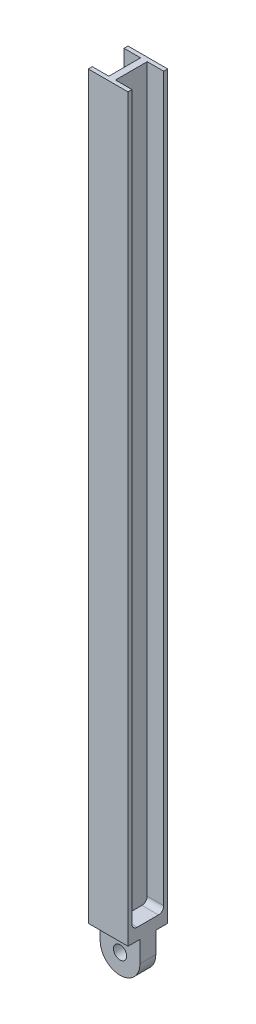
ISO-10303-21;
HEADER;
FILE_DESCRIPTION(('STEP AP214'),'2;1');
FILE_NAME('part.step','',(''),(''),'','','');
FILE_SCHEMA(('AUTOMOTIVE_DESIGN { 1 0 10303 214 1 1 1 1 }'));
ENDSEC;
DATA;
#1=APPLICATION_CONTEXT('core data for automotive mechanical design processes');
#2=APPLICATION_PROTOCOL_DEFINITION('international standard','automotive_design',2000,#1);
#3=PRODUCT_CONTEXT('',#1,'mechanical');
#4=PRODUCT('Part','Part','',(#3));
#5=PRODUCT_RELATED_PRODUCT_CATEGORY('part','',(#4));
#6=PRODUCT_DEFINITION_FORMATION('','',#4);
#7=PRODUCT_DEFINITION_CONTEXT('part definition',#1,'design');
#8=PRODUCT_DEFINITION('design','',#6,#7);
#9=PRODUCT_DEFINITION_SHAPE('','',#8);
#10=(LENGTH_UNIT() NAMED_UNIT(*) SI_UNIT(.MILLI.,.METRE.));
#11=(NAMED_UNIT(*) PLANE_ANGLE_UNIT() SI_UNIT($,.RADIAN.));
#12=(NAMED_UNIT(*) SI_UNIT($,.STERADIAN.) SOLID_ANGLE_UNIT());
#13=UNCERTAINTY_MEASURE_WITH_UNIT(LENGTH_MEASURE(1.E-05),#10,'distance_accuracy_value','');
#14=(GEOMETRIC_REPRESENTATION_CONTEXT(3) GLOBAL_UNCERTAINTY_ASSIGNED_CONTEXT((#13)) GLOBAL_UNIT_ASSIGNED_CONTEXT((#10,
#11,#12)) REPRESENTATION_CONTEXT('',''));
#15=CARTESIAN_POINT('',(0.,0.,0.));
#16=DIRECTION('',(0.,0.,1.));
#17=DIRECTION('',(1.,0.,0.));
#18=AXIS2_PLACEMENT_3D('',#15,#16,#17);
#19=CARTESIAN_POINT('',(17.5,550.,-2.99999999999999));
#20=DIRECTION('',(-1.,0.,0.));
#21=DIRECTION('',(0.,0.,1.));
#22=AXIS2_PLACEMENT_3D('',#19,#20,#21);
#23=PLANE('',#22);
#24=DIRECTION('',(0.,0.,1.));
#25=VECTOR('',#24,1.);
#26=CARTESIAN_POINT('',(17.5,-9.,18.));
#27=LINE('',#26,#25);
#28=CARTESIAN_POINT('',(17.5,-9.,18.));
#29=VERTEX_POINT('',#28);
#30=CARTESIAN_POINT('',(17.5,-9.,27.));
#31=VERTEX_POINT('',#30);
#32=EDGE_CURVE('E195',#29,#31,#27,.T.);
#33=ORIENTED_EDGE('',*,*,#32,.F.);
#34=DIRECTION('',(0.,-1.,0.));
#35=VECTOR('',#34,1.);
#36=CARTESIAN_POINT('',(17.5,-9.,18.));
#37=LINE('',#36,#35);
#38=CARTESIAN_POINT('',(17.5,-25.,18.));
#39=VERTEX_POINT('',#38);
#40=EDGE_CURVE('E194',#29,#39,#37,.T.);
#41=ORIENTED_EDGE('',*,*,#40,.T.);
#42=DIRECTION('',(0.,0.,1.));
#43=VECTOR('',#42,1.);
#44=CARTESIAN_POINT('',(17.5,-25.,-2.99999999999999));
#45=LINE('',#44,#43);
#46=CARTESIAN_POINT('',(17.5,-25.,6.00000000000002));
#47=VERTEX_POINT('',#46);
#48=EDGE_CURVE('E174',#47,#39,#45,.T.);
#49=ORIENTED_EDGE('',*,*,#48,.F.);
#50=DIRECTION('',(0.,-1.,0.));
#51=VECTOR('',#50,1.);
#52=CARTESIAN_POINT('',(17.5,-9.,6.00000000000002));
#53=LINE('',#52,#51);
#54=CARTESIAN_POINT('',(17.5,-9.,6.00000000000002));
#55=VERTEX_POINT('',#54);
#56=EDGE_CURVE('E209',#55,#47,#53,.T.);
#57=ORIENTED_EDGE('',*,*,#56,.F.);
#58=DIRECTION('',(0.,0.,1.));
#59=VECTOR('',#58,1.);
#60=CARTESIAN_POINT('',(17.5,-9.,-2.99999999999999));
#61=LINE('',#60,#59);
#62=CARTESIAN_POINT('',(17.5,-9.,-2.99999999999999));
#63=VERTEX_POINT('',#62);
#64=EDGE_CURVE('E204',#63,#55,#61,.T.);
#65=ORIENTED_EDGE('',*,*,#64,.F.);
#66=DIRECTION('',(0.,-1.,0.));
#67=VECTOR('',#66,1.);
#68=CARTESIAN_POINT('',(17.5,550.,-2.99999999999999));
#69=LINE('',#68,#67);
#70=CARTESIAN_POINT('',(17.5,550.,-2.99999999999999));
#71=VERTEX_POINT('',#70);
#72=EDGE_CURVE('E284',#71,#63,#69,.T.);
#73=ORIENTED_EDGE('',*,*,#72,.F.);
#74=DIRECTION('',(0.,0.,-1.));
#75=VECTOR('',#74,1.);
#76=CARTESIAN_POINT('',(17.5,550.,-2.99999999999999));
#77=LINE('',#76,#75);
#78=CARTESIAN_POINT('',(17.5,550.,0.));
#79=VERTEX_POINT('',#78);
#80=EDGE_CURVE('E355',#79,#71,#77,.T.);
#81=ORIENTED_EDGE('',*,*,#80,.F.);
#82=DIRECTION('',(0.,-1.,0.));
#83=VECTOR('',#82,1.);
#84=CARTESIAN_POINT('',(17.5,550.,0.));
#85=LINE('',#84,#83);
#86=CARTESIAN_POINT('',(17.5,4.,0.));
#87=VERTEX_POINT('',#86);
#88=EDGE_CURVE('E287',#79,#87,#85,.T.);
#89=ORIENTED_EDGE('',*,*,#88,.T.);
#90=CARTESIAN_POINT('',(17.5,4.,4.));
#91=DIRECTION('',(-1.,0.,0.));
#92=DIRECTION('',(0.,0.,1.));
#93=AXIS2_PLACEMENT_3D('',#90,#91,#92);
#94=CIRCLE('',#93,4.);
#95=CARTESIAN_POINT('',(17.5,0.,4.));
#96=VERTEX_POINT('',#95);
#97=EDGE_CURVE('E234',#87,#96,#94,.T.);
#98=ORIENTED_EDGE('',*,*,#97,.T.);
#99=DIRECTION('',(0.,0.,1.));
#100=VECTOR('',#99,1.);
#101=CARTESIAN_POINT('',(17.5,0.,-2.99999999999999));
#102=LINE('',#101,#100);
#103=CARTESIAN_POINT('',(17.5,0.,20.));
#104=VERTEX_POINT('',#103);
#105=EDGE_CURVE('E211',#96,#104,#102,.T.);
#106=ORIENTED_EDGE('',*,*,#105,.T.);
#107=CARTESIAN_POINT('',(17.5,4.,20.));
#108=DIRECTION('',(-1.,0.,0.));
#109=DIRECTION('',(0.,0.,1.));
#110=AXIS2_PLACEMENT_3D('',#107,#108,#109);
#111=CIRCLE('',#110,4.);
#112=CARTESIAN_POINT('',(17.5,4.,24.));
#113=VERTEX_POINT('',#112);
#114=EDGE_CURVE('E232',#104,#113,#111,.T.);
#115=ORIENTED_EDGE('',*,*,#114,.T.);
#116=DIRECTION('',(0.,-1.,0.));
#117=VECTOR('',#116,1.);
#118=CARTESIAN_POINT('',(17.5,550.,24.));
#119=LINE('',#118,#117);
#120=CARTESIAN_POINT('',(17.5,550.,24.));
#121=VERTEX_POINT('',#120);
#122=EDGE_CURVE('E294',#121,#113,#119,.T.);
#123=ORIENTED_EDGE('',*,*,#122,.F.);
#124=DIRECTION('',(0.,0.,-1.));
#125=VECTOR('',#124,1.);
#126=CARTESIAN_POINT('',(17.5,550.,24.));
#127=LINE('',#126,#125);
#128=CARTESIAN_POINT('',(17.5,550.,27.));
#129=VERTEX_POINT('',#128);
#130=EDGE_CURVE('E347',#129,#121,#127,.T.);
#131=ORIENTED_EDGE('',*,*,#130,.F.);
#132=DIRECTION('',(0.,-1.,0.));
#133=VECTOR('',#132,1.);
#134=CARTESIAN_POINT('',(17.5,550.,27.));
#135=LINE('',#134,#133);
#136=EDGE_CURVE('E295',#129,#31,#135,.T.);
#137=ORIENTED_EDGE('',*,*,#136,.T.);
#138=EDGE_LOOP('',(#33,#41,#49,#57,#65,#73,#81,#89,#98,#106,#115,#123,#131,#137));
#139=FACE_BOUND('',#138,.T.);
#140=ADVANCED_FACE('F31',(#139),#23,.F.);
#141=CARTESIAN_POINT('',(-12.5,-9.,6.00000000000002));
#142=DIRECTION('',(0.,0.,1.));
#143=DIRECTION('',(1.,0.,0.));
#144=AXIS2_PLACEMENT_3D('',#141,#142,#143);
#145=PLANE('',#144);
#146=CARTESIAN_POINT('',(2.5,-25.,6.00000000000002));
#147=DIRECTION('',(0.,0.,1.));
#148=DIRECTION('',(1.,0.,0.));
#149=AXIS2_PLACEMENT_3D('',#146,#147,#148);
#150=CIRCLE('',#149,5.);
#151=CARTESIAN_POINT('',(7.50000000000001,-25.,6.00000000000002));
#152=VERTEX_POINT('',#151);
#153=EDGE_CURVE('E386',#152,#152,#150,.T.);
#154=ORIENTED_EDGE('',*,*,#153,.T.);
#155=EDGE_LOOP('',(#154));
#156=FACE_BOUND('',#155,.T.);
#157=CARTESIAN_POINT('',(2.5,-25.,6.00000000000002));
#158=DIRECTION('',(0.,0.,1.));
#159=DIRECTION('',(1.,0.,0.));
#160=AXIS2_PLACEMENT_3D('',#157,#158,#159);
#161=CIRCLE('',#160,15.);
#162=CARTESIAN_POINT('',(-12.5,-25.,6.00000000000002));
#163=VERTEX_POINT('',#162);
#164=EDGE_CURVE('E188',#163,#47,#161,.T.);
#165=ORIENTED_EDGE('',*,*,#164,.F.);
#166=DIRECTION('',(0.,-1.,0.));
#167=VECTOR('',#166,1.);
#168=CARTESIAN_POINT('',(-12.5,-9.,6.00000000000002));
#169=LINE('',#168,#167);
#170=CARTESIAN_POINT('',(-12.5,-9.,6.00000000000002));
#171=VERTEX_POINT('',#170);
#172=EDGE_CURVE('E187',#171,#163,#169,.T.);
#173=ORIENTED_EDGE('',*,*,#172,.F.);
#174=DIRECTION('',(-1.,0.,0.));
#175=VECTOR('',#174,1.);
#176=CARTESIAN_POINT('',(-12.5,-9.,6.00000000000002));
#177=LINE('',#176,#175);
#178=EDGE_CURVE('E206',#55,#171,#177,.T.);
#179=ORIENTED_EDGE('',*,*,#178,.F.);
#180=ORIENTED_EDGE('',*,*,#56,.T.);
#181=EDGE_LOOP('',(#165,#173,#179,#180));
#182=FACE_BOUND('',#181,.T.);
#183=ADVANCED_FACE('F397',(#156,#182),#145,.F.);
#184=CARTESIAN_POINT('',(-12.5,-9.,18.));
#185=DIRECTION('',(0.,0.,-1.));
#186=DIRECTION('',(-1.,0.,0.));
#187=AXIS2_PLACEMENT_3D('',#184,#185,#186);
#188=PLANE('',#187);
#189=CARTESIAN_POINT('',(2.5,-25.,18.));
#190=DIRECTION('',(0.,0.,1.));
#191=DIRECTION('',(1.,0.,0.));
#192=AXIS2_PLACEMENT_3D('',#189,#190,#191);
#193=CIRCLE('',#192,5.);
#194=CARTESIAN_POINT('',(7.50000000000001,-25.,18.));
#195=VERTEX_POINT('',#194);
#196=EDGE_CURVE('E389',#195,#195,#193,.T.);
#197=ORIENTED_EDGE('',*,*,#196,.F.);
#198=EDGE_LOOP('',(#197));
#199=FACE_BOUND('',#198,.T.);
#200=CARTESIAN_POINT('',(2.5,-25.,18.));
#201=DIRECTION('',(0.,0.,1.));
#202=DIRECTION('',(1.,0.,0.));
#203=AXIS2_PLACEMENT_3D('',#200,#201,#202);
#204=CIRCLE('',#203,15.);
#205=CARTESIAN_POINT('',(-12.5,-25.,18.));
#206=VERTEX_POINT('',#205);
#207=EDGE_CURVE('E168',#206,#39,#204,.T.);
#208=ORIENTED_EDGE('',*,*,#207,.T.);
#209=ORIENTED_EDGE('',*,*,#40,.F.);
#210=DIRECTION('',(1.,0.,0.));
#211=VECTOR('',#210,1.);
#212=CARTESIAN_POINT('',(-12.5,-9.,18.));
#213=LINE('',#212,#211);
#214=CARTESIAN_POINT('',(-12.5,-9.,18.));
#215=VERTEX_POINT('',#214);
#216=EDGE_CURVE('E192',#215,#29,#213,.T.);
#217=ORIENTED_EDGE('',*,*,#216,.F.);
#218=DIRECTION('',(0.,-1.,0.));
#219=VECTOR('',#218,1.);
#220=CARTESIAN_POINT('',(-12.5,-9.,18.));
#221=LINE('',#220,#219);
#222=EDGE_CURVE('E185',#215,#206,#221,.T.);
#223=ORIENTED_EDGE('',*,*,#222,.T.);
#224=EDGE_LOOP('',(#208,#209,#217,#223));
#225=FACE_BOUND('',#224,.T.);
#226=ADVANCED_FACE('F190',(#199,#225),#188,.F.);
#227=CARTESIAN_POINT('',(17.5,550.,27.));
#228=DIRECTION('',(0.,0.,-1.));
#229=DIRECTION('',(-1.,0.,0.));
#230=AXIS2_PLACEMENT_3D('',#227,#228,#229);
#231=PLANE('',#230);
#232=DIRECTION('',(-1.,0.,0.));
#233=VECTOR('',#232,1.);
#234=CARTESIAN_POINT('',(17.5,-9.,27.));
#235=LINE('',#234,#233);
#236=CARTESIAN_POINT('',(-12.5,-9.,27.));
#237=VERTEX_POINT('',#236);
#238=EDGE_CURVE('E378',#31,#237,#235,.T.);
#239=ORIENTED_EDGE('',*,*,#238,.F.);
#240=ORIENTED_EDGE('',*,*,#136,.F.);
#241=DIRECTION('',(1.,0.,0.));
#242=VECTOR('',#241,1.);
#243=CARTESIAN_POINT('',(17.5,550.,27.));
#244=LINE('',#243,#242);
#245=CARTESIAN_POINT('',(-12.5,550.,27.));
#246=VERTEX_POINT('',#245);
#247=EDGE_CURVE('E351',#246,#129,#244,.T.);
#248=ORIENTED_EDGE('',*,*,#247,.F.);
#249=DIRECTION('',(0.,-1.,0.));
#250=VECTOR('',#249,1.);
#251=CARTESIAN_POINT('',(-12.5,550.,27.));
#252=LINE('',#251,#250);
#253=EDGE_CURVE('E298',#246,#237,#252,.T.);
#254=ORIENTED_EDGE('',*,*,#253,.T.);
#255=EDGE_LOOP('',(#239,#240,#248,#254));
#256=FACE_BOUND('',#255,.T.);
#257=ADVANCED_FACE('F377',(#256),#231,.F.);
#258=CARTESIAN_POINT('',(-12.5,550.,-2.99999999999999));
#259=DIRECTION('',(0.,0.,1.));
#260=DIRECTION('',(1.,0.,0.));
#261=AXIS2_PLACEMENT_3D('',#258,#259,#260);
#262=PLANE('',#261);
#263=DIRECTION('',(1.,0.,0.));
#264=VECTOR('',#263,1.);
#265=CARTESIAN_POINT('',(-12.5,-9.,-2.99999999999999));
#266=LINE('',#265,#264);
#267=CARTESIAN_POINT('',(-12.5,-9.,-2.99999999999999));
#268=VERTEX_POINT('',#267);
#269=EDGE_CURVE('E202',#268,#63,#266,.T.);
#270=ORIENTED_EDGE('',*,*,#269,.F.);
#271=DIRECTION('',(0.,-1.,0.));
#272=VECTOR('',#271,1.);
#273=CARTESIAN_POINT('',(-12.5,550.,-2.99999999999999));
#274=LINE('',#273,#272);
#275=CARTESIAN_POINT('',(-12.5,550.,-2.99999999999999));
#276=VERTEX_POINT('',#275);
#277=EDGE_CURVE('E281',#276,#268,#274,.T.);
#278=ORIENTED_EDGE('',*,*,#277,.F.);
#279=DIRECTION('',(-1.,0.,0.));
#280=VECTOR('',#279,1.);
#281=CARTESIAN_POINT('',(-12.5,550.,-2.99999999999999));
#282=LINE('',#281,#280);
#283=EDGE_CURVE('E278',#71,#276,#282,.T.);
#284=ORIENTED_EDGE('',*,*,#283,.F.);
#285=ORIENTED_EDGE('',*,*,#72,.T.);
#286=EDGE_LOOP('',(#270,#278,#284,#285));
#287=FACE_BOUND('',#286,.T.);
#288=ADVANCED_FACE('F363',(#287),#262,.F.);
#289=CARTESIAN_POINT('',(0.,550.,0.));
#290=DIRECTION('',(0.,0.,-1.));
#291=DIRECTION('',(-1.,0.,0.));
#292=AXIS2_PLACEMENT_3D('',#289,#290,#291);
#293=PLANE('',#292);
#294=DIRECTION('',(0.,-1.,0.));
#295=VECTOR('',#294,1.);
#296=CARTESIAN_POINT('',(-12.5,550.,0.));
#297=LINE('',#296,#295);
#298=CARTESIAN_POINT('',(-12.5,550.,0.));
#299=VERTEX_POINT('',#298);
#300=CARTESIAN_POINT('',(-12.5,4.,0.));
#301=VERTEX_POINT('',#300);
#302=EDGE_CURVE('E253',#299,#301,#297,.T.);
#303=ORIENTED_EDGE('',*,*,#302,.T.);
#304=DIRECTION('',(1.,0.,0.));
#305=VECTOR('',#304,1.);
#306=CARTESIAN_POINT('',(0.,4.,0.));
#307=LINE('',#306,#305);
#308=CARTESIAN_POINT('',(0.,4.,0.));
#309=VERTEX_POINT('',#308);
#310=EDGE_CURVE('E236',#301,#309,#307,.T.);
#311=ORIENTED_EDGE('',*,*,#310,.T.);
#312=DIRECTION('',(0.,-1.,0.));
#313=VECTOR('',#312,1.);
#314=CARTESIAN_POINT('',(0.,550.,0.));
#315=LINE('',#314,#313);
#316=CARTESIAN_POINT('',(0.,550.,0.));
#317=VERTEX_POINT('',#316);
#318=EDGE_CURVE('E263',#317,#309,#315,.T.);
#319=ORIENTED_EDGE('',*,*,#318,.F.);
#320=DIRECTION('',(1.,0.,0.));
#321=VECTOR('',#320,1.);
#322=CARTESIAN_POINT('',(0.,550.,0.));
#323=LINE('',#322,#321);
#324=EDGE_CURVE('E260',#299,#317,#323,.T.);
#325=ORIENTED_EDGE('',*,*,#324,.F.);
#326=EDGE_LOOP('',(#303,#311,#319,#325));
#327=FACE_BOUND('',#326,.T.);
#328=ADVANCED_FACE('F257',(#327),#293,.F.);
#329=CARTESIAN_POINT('',(0.,550.,24.));
#330=DIRECTION('',(1.,0.,0.));
#331=DIRECTION('',(0.,0.,-1.));
#332=AXIS2_PLACEMENT_3D('',#329,#330,#331);
#333=PLANE('',#332);
#334=ORIENTED_EDGE('',*,*,#318,.T.);
#335=CARTESIAN_POINT('',(0.,4.,4.));
#336=DIRECTION('',(1.,0.,0.));
#337=DIRECTION('',(0.,0.,-1.));
#338=AXIS2_PLACEMENT_3D('',#335,#336,#337);
#339=CIRCLE('',#338,4.);
#340=CARTESIAN_POINT('',(0.,0.,4.00000000000001));
#341=VERTEX_POINT('',#340);
#342=EDGE_CURVE('E241',#309,#341,#339,.F.);
#343=ORIENTED_EDGE('',*,*,#342,.T.);
#344=DIRECTION('',(0.,0.,1.));
#345=VECTOR('',#344,1.);
#346=CARTESIAN_POINT('',(0.,0.,24.));
#347=LINE('',#346,#345);
#348=CARTESIAN_POINT('',(0.,0.,20.));
#349=VERTEX_POINT('',#348);
#350=EDGE_CURVE('E245',#341,#349,#347,.T.);
#351=ORIENTED_EDGE('',*,*,#350,.T.);
#352=CARTESIAN_POINT('',(0.,4.,20.));
#353=DIRECTION('',(1.,0.,0.));
#354=DIRECTION('',(0.,0.,-1.));
#355=AXIS2_PLACEMENT_3D('',#352,#353,#354);
#356=CIRCLE('',#355,4.);
#357=CARTESIAN_POINT('',(0.,4.,24.));
#358=VERTEX_POINT('',#357);
#359=EDGE_CURVE('E239',#349,#358,#356,.F.);
#360=ORIENTED_EDGE('',*,*,#359,.T.);
#361=DIRECTION('',(0.,-1.,0.));
#362=VECTOR('',#361,1.);
#363=CARTESIAN_POINT('',(0.,550.,24.));
#364=LINE('',#363,#362);
#365=CARTESIAN_POINT('',(0.,550.,24.));
#366=VERTEX_POINT('',#365);
#367=EDGE_CURVE('E302',#366,#358,#364,.T.);
#368=ORIENTED_EDGE('',*,*,#367,.F.);
#369=DIRECTION('',(0.,0.,1.));
#370=VECTOR('',#369,1.);
#371=CARTESIAN_POINT('',(0.,550.,24.));
#372=LINE('',#371,#370);
#373=EDGE_CURVE('E364',#317,#366,#372,.T.);
#374=ORIENTED_EDGE('',*,*,#373,.F.);
#375=EDGE_LOOP('',(#334,#343,#351,#360,#368,#374));
#376=FACE_BOUND('',#375,.T.);
#377=ADVANCED_FACE('F268',(#376),#333,.F.);
#378=CARTESIAN_POINT('',(-12.5,550.,24.));
#379=DIRECTION('',(0.,0.,1.));
#380=DIRECTION('',(1.,0.,0.));
#381=AXIS2_PLACEMENT_3D('',#378,#379,#380);
#382=PLANE('',#381);
#383=ORIENTED_EDGE('',*,*,#367,.T.);
#384=DIRECTION('',(-1.,0.,0.));
#385=VECTOR('',#384,1.);
#386=CARTESIAN_POINT('',(-12.5,4.,24.));
#387=LINE('',#386,#385);
#388=CARTESIAN_POINT('',(-12.5,4.,24.));
#389=VERTEX_POINT('',#388);
#390=EDGE_CURVE('E248',#358,#389,#387,.T.);
#391=ORIENTED_EDGE('',*,*,#390,.T.);
#392=DIRECTION('',(0.,-1.,0.));
#393=VECTOR('',#392,1.);
#394=CARTESIAN_POINT('',(-12.5,550.,24.));
#395=LINE('',#394,#393);
#396=CARTESIAN_POINT('',(-12.5,550.,24.));
#397=VERTEX_POINT('',#396);
#398=EDGE_CURVE('E301',#397,#389,#395,.T.);
#399=ORIENTED_EDGE('',*,*,#398,.F.);
#400=DIRECTION('',(-1.,0.,0.));
#401=VECTOR('',#400,1.);
#402=CARTESIAN_POINT('',(-12.5,550.,24.));
#403=LINE('',#402,#401);
#404=EDGE_CURVE('E368',#366,#397,#403,.T.);
#405=ORIENTED_EDGE('',*,*,#404,.F.);
#406=EDGE_LOOP('',(#383,#391,#399,#405));
#407=FACE_BOUND('',#406,.T.);
#408=ADVANCED_FACE('F434',(#407),#382,.F.);
#409=CARTESIAN_POINT('',(-12.5,550.,27.));
#410=DIRECTION('',(1.,0.,0.));
#411=DIRECTION('',(0.,0.,-1.));
#412=AXIS2_PLACEMENT_3D('',#409,#410,#411);
#413=PLANE('',#412);
#414=ORIENTED_EDGE('',*,*,#398,.T.);
#415=CARTESIAN_POINT('',(-12.5,4.,20.));
#416=DIRECTION('',(1.,0.,0.));
#417=DIRECTION('',(0.,0.,-1.));
#418=AXIS2_PLACEMENT_3D('',#415,#416,#417);
#419=CIRCLE('',#418,4.);
#420=CARTESIAN_POINT('',(-12.5,0.,20.));
#421=VERTEX_POINT('',#420);
#422=EDGE_CURVE('E12',#389,#421,#419,.T.);
#423=ORIENTED_EDGE('',*,*,#422,.T.);
#424=DIRECTION('',(0.,0.,-1.));
#425=VECTOR('',#424,1.);
#426=CARTESIAN_POINT('',(-12.5,0.,27.));
#427=LINE('',#426,#425);
#428=CARTESIAN_POINT('',(-12.5,0.,4.00000000000001));
#429=VERTEX_POINT('',#428);
#430=EDGE_CURVE('E222',#421,#429,#427,.T.);
#431=ORIENTED_EDGE('',*,*,#430,.T.);
#432=CARTESIAN_POINT('',(-12.5,4.,4.));
#433=DIRECTION('',(1.,0.,0.));
#434=DIRECTION('',(0.,0.,-1.));
#435=AXIS2_PLACEMENT_3D('',#432,#433,#434);
#436=CIRCLE('',#435,4.);
#437=EDGE_CURVE('E39',#429,#301,#436,.T.);
#438=ORIENTED_EDGE('',*,*,#437,.T.);
#439=ORIENTED_EDGE('',*,*,#302,.F.);
#440=DIRECTION('',(0.,0.,1.));
#441=VECTOR('',#440,1.);
#442=CARTESIAN_POINT('',(-12.5,550.,0.));
#443=LINE('',#442,#441);
#444=EDGE_CURVE('E275',#276,#299,#443,.T.);
#445=ORIENTED_EDGE('',*,*,#444,.F.);
#446=ORIENTED_EDGE('',*,*,#277,.T.);
#447=DIRECTION('',(0.,0.,-1.));
#448=VECTOR('',#447,1.);
#449=CARTESIAN_POINT('',(-12.5,-9.,6.00000000000002));
#450=LINE('',#449,#448);
#451=EDGE_CURVE('E197',#171,#268,#450,.T.);
#452=ORIENTED_EDGE('',*,*,#451,.F.);
#453=ORIENTED_EDGE('',*,*,#172,.T.);
#454=DIRECTION('',(0.,0.,1.));
#455=VECTOR('',#454,1.);
#456=CARTESIAN_POINT('',(-12.5,-25.,-2.99999999999999));
#457=LINE('',#456,#455);
#458=EDGE_CURVE('E171',#163,#206,#457,.T.);
#459=ORIENTED_EDGE('',*,*,#458,.T.);
#460=ORIENTED_EDGE('',*,*,#222,.F.);
#461=DIRECTION('',(0.,0.,-1.));
#462=VECTOR('',#461,1.);
#463=CARTESIAN_POINT('',(-12.5,-9.,27.));
#464=LINE('',#463,#462);
#465=EDGE_CURVE('E381',#237,#215,#464,.T.);
#466=ORIENTED_EDGE('',*,*,#465,.F.);
#467=ORIENTED_EDGE('',*,*,#253,.F.);
#468=DIRECTION('',(0.,0.,1.));
#469=VECTOR('',#468,1.);
#470=CARTESIAN_POINT('',(-12.5,550.,27.));
#471=LINE('',#470,#469);
#472=EDGE_CURVE('E370',#397,#246,#471,.T.);
#473=ORIENTED_EDGE('',*,*,#472,.F.);
#474=EDGE_LOOP('',(#414,#423,#431,#438,#439,#445,#446,#452,#453,#459,#460,#466,#467,#473));
#475=FACE_BOUND('',#474,.T.);
#476=ADVANCED_FACE('F183',(#475),#413,.F.);
#477=CARTESIAN_POINT('',(5.,550.,24.));
#478=DIRECTION('',(0.,0.,1.));
#479=DIRECTION('',(1.,0.,0.));
#480=AXIS2_PLACEMENT_3D('',#477,#478,#479);
#481=PLANE('',#480);
#482=ORIENTED_EDGE('',*,*,#122,.T.);
#483=DIRECTION('',(-1.,0.,0.));
#484=VECTOR('',#483,1.);
#485=CARTESIAN_POINT('',(5.,4.,24.));
#486=LINE('',#485,#484);
#487=CARTESIAN_POINT('',(5.,4.,24.));
#488=VERTEX_POINT('',#487);
#489=EDGE_CURVE('E262',#113,#488,#486,.T.);
#490=ORIENTED_EDGE('',*,*,#489,.T.);
#491=DIRECTION('',(0.,-1.,0.));
#492=VECTOR('',#491,1.);
#493=CARTESIAN_POINT('',(5.,550.,24.));
#494=LINE('',#493,#492);
#495=CARTESIAN_POINT('',(5.,550.,24.));
#496=VERTEX_POINT('',#495);
#497=EDGE_CURVE('E291',#496,#488,#494,.T.);
#498=ORIENTED_EDGE('',*,*,#497,.F.);
#499=DIRECTION('',(-1.,0.,0.));
#500=VECTOR('',#499,1.);
#501=CARTESIAN_POINT('',(5.,550.,24.));
#502=LINE('',#501,#500);
#503=EDGE_CURVE('E344',#121,#496,#502,.T.);
#504=ORIENTED_EDGE('',*,*,#503,.F.);
#505=EDGE_LOOP('',(#482,#490,#498,#504));
#506=FACE_BOUND('',#505,.T.);
#507=ADVANCED_FACE('F343',(#506),#481,.F.);
#508=CARTESIAN_POINT('',(5.,550.,0.));
#509=DIRECTION('',(-1.,0.,0.));
#510=DIRECTION('',(0.,0.,1.));
#511=AXIS2_PLACEMENT_3D('',#508,#509,#510);
#512=PLANE('',#511);
#513=ORIENTED_EDGE('',*,*,#497,.T.);
#514=CARTESIAN_POINT('',(5.,4.,20.));
#515=DIRECTION('',(-1.,0.,0.));
#516=DIRECTION('',(0.,0.,1.));
#517=AXIS2_PLACEMENT_3D('',#514,#515,#516);
#518=CIRCLE('',#517,4.);
#519=CARTESIAN_POINT('',(5.,0.,20.));
#520=VERTEX_POINT('',#519);
#521=EDGE_CURVE('E223',#488,#520,#518,.F.);
#522=ORIENTED_EDGE('',*,*,#521,.T.);
#523=DIRECTION('',(0.,0.,-1.));
#524=VECTOR('',#523,1.);
#525=CARTESIAN_POINT('',(5.,0.,0.));
#526=LINE('',#525,#524);
#527=CARTESIAN_POINT('',(5.,0.,4.));
#528=VERTEX_POINT('',#527);
#529=EDGE_CURVE('E272',#520,#528,#526,.T.);
#530=ORIENTED_EDGE('',*,*,#529,.T.);
#531=CARTESIAN_POINT('',(5.,4.,4.));
#532=DIRECTION('',(-1.,0.,0.));
#533=DIRECTION('',(0.,0.,1.));
#534=AXIS2_PLACEMENT_3D('',#531,#532,#533);
#535=CIRCLE('',#534,4.);
#536=CARTESIAN_POINT('',(5.,4.,0.));
#537=VERTEX_POINT('',#536);
#538=EDGE_CURVE('E320',#528,#537,#535,.F.);
#539=ORIENTED_EDGE('',*,*,#538,.T.);
#540=DIRECTION('',(0.,-1.,0.));
#541=VECTOR('',#540,1.);
#542=CARTESIAN_POINT('',(5.,550.,0.));
#543=LINE('',#542,#541);
#544=CARTESIAN_POINT('',(5.,550.,0.));
#545=VERTEX_POINT('',#544);
#546=EDGE_CURVE('E288',#545,#537,#543,.T.);
#547=ORIENTED_EDGE('',*,*,#546,.F.);
#548=DIRECTION('',(0.,0.,-1.));
#549=VECTOR('',#548,1.);
#550=CARTESIAN_POINT('',(5.,550.,0.));
#551=LINE('',#550,#549);
#552=EDGE_CURVE('E346',#496,#545,#551,.T.);
#553=ORIENTED_EDGE('',*,*,#552,.F.);
#554=EDGE_LOOP('',(#513,#522,#530,#539,#547,#553));
#555=FACE_BOUND('',#554,.T.);
#556=ADVANCED_FACE('F325',(#555),#512,.F.);
#557=CARTESIAN_POINT('',(17.5,550.,0.));
#558=DIRECTION('',(0.,0.,-1.));
#559=DIRECTION('',(-1.,0.,0.));
#560=AXIS2_PLACEMENT_3D('',#557,#558,#559);
#561=PLANE('',#560);
#562=ORIENTED_EDGE('',*,*,#546,.T.);
#563=DIRECTION('',(1.,0.,0.));
#564=VECTOR('',#563,1.);
#565=CARTESIAN_POINT('',(17.5,4.,0.));
#566=LINE('',#565,#564);
#567=EDGE_CURVE('E229',#537,#87,#566,.T.);
#568=ORIENTED_EDGE('',*,*,#567,.T.);
#569=ORIENTED_EDGE('',*,*,#88,.F.);
#570=DIRECTION('',(1.,0.,0.));
#571=VECTOR('',#570,1.);
#572=CARTESIAN_POINT('',(17.5,550.,0.));
#573=LINE('',#572,#571);
#574=EDGE_CURVE('E349',#545,#79,#573,.T.);
#575=ORIENTED_EDGE('',*,*,#574,.F.);
#576=EDGE_LOOP('',(#562,#568,#569,#575));
#577=FACE_BOUND('',#576,.T.);
#578=ADVANCED_FACE('F403',(#577),#561,.F.);
#579=CARTESIAN_POINT('',(-12.5,550.,-2.99999999999999));
#580=DIRECTION('',(0.,-1.,0.));
#581=DIRECTION('',(0.,0.,-1.));
#582=AXIS2_PLACEMENT_3D('',#579,#580,#581);
#583=PLANE('',#582);
#584=ORIENTED_EDGE('',*,*,#444,.T.);
#585=ORIENTED_EDGE('',*,*,#324,.T.);
#586=ORIENTED_EDGE('',*,*,#373,.T.);
#587=ORIENTED_EDGE('',*,*,#404,.T.);
#588=ORIENTED_EDGE('',*,*,#472,.T.);
#589=ORIENTED_EDGE('',*,*,#247,.T.);
#590=ORIENTED_EDGE('',*,*,#130,.T.);
#591=ORIENTED_EDGE('',*,*,#503,.T.);
#592=ORIENTED_EDGE('',*,*,#552,.T.);
#593=ORIENTED_EDGE('',*,*,#574,.T.);
#594=ORIENTED_EDGE('',*,*,#80,.T.);
#595=ORIENTED_EDGE('',*,*,#283,.T.);
#596=EDGE_LOOP('',(#584,#585,#586,#587,#588,#589,#590,#591,#592,#593,#594,#595));
#597=FACE_BOUND('',#596,.T.);
#598=ADVANCED_FACE('F360',(#597),#583,.F.);
#599=CARTESIAN_POINT('',(-12.5,0.,-2.99999999999998));
#600=DIRECTION('',(0.,1.,0.));
#601=DIRECTION('',(0.,0.,1.));
#602=AXIS2_PLACEMENT_3D('',#599,#600,#601);
#603=PLANE('',#602);
#604=ORIENTED_EDGE('',*,*,#529,.F.);
#605=DIRECTION('',(-1.,0.,0.));
#606=VECTOR('',#605,1.);
#607=CARTESIAN_POINT('',(-12.5,0.,20.));
#608=LINE('',#607,#606);
#609=EDGE_CURVE('E227',#520,#104,#608,.F.);
#610=ORIENTED_EDGE('',*,*,#609,.T.);
#611=ORIENTED_EDGE('',*,*,#105,.F.);
#612=DIRECTION('',(1.,0.,0.));
#613=VECTOR('',#612,1.);
#614=CARTESIAN_POINT('',(-12.5,0.,4.));
#615=LINE('',#614,#613);
#616=EDGE_CURVE('E225',#96,#528,#615,.F.);
#617=ORIENTED_EDGE('',*,*,#616,.T.);
#618=EDGE_LOOP('',(#604,#610,#611,#617));
#619=FACE_BOUND('',#618,.T.);
#620=ADVANCED_FACE('F332',(#619),#603,.T.);
#621=ORIENTED_EDGE('',*,*,#350,.F.);
#622=DIRECTION('',(1.,0.,0.));
#623=VECTOR('',#622,1.);
#624=CARTESIAN_POINT('',(-12.5,0.,4.));
#625=LINE('',#624,#623);
#626=EDGE_CURVE('E52',#341,#429,#625,.F.);
#627=ORIENTED_EDGE('',*,*,#626,.T.);
#628=ORIENTED_EDGE('',*,*,#430,.F.);
#629=DIRECTION('',(-1.,0.,0.));
#630=VECTOR('',#629,1.);
#631=CARTESIAN_POINT('',(-12.5,0.,20.));
#632=LINE('',#631,#630);
#633=EDGE_CURVE('E243',#421,#349,#632,.F.);
#634=ORIENTED_EDGE('',*,*,#633,.T.);
#635=EDGE_LOOP('',(#621,#627,#628,#634));
#636=FACE_BOUND('',#635,.T.);
#637=ADVANCED_FACE('F271',(#636),#603,.T.);
#638=CARTESIAN_POINT('',(-12.5,-9.,6.00000000000002));
#639=DIRECTION('',(0.,-1.,0.));
#640=DIRECTION('',(0.,0.,-1.));
#641=AXIS2_PLACEMENT_3D('',#638,#639,#640);
#642=PLANE('',#641);
#643=ORIENTED_EDGE('',*,*,#451,.T.);
#644=ORIENTED_EDGE('',*,*,#269,.T.);
#645=ORIENTED_EDGE('',*,*,#64,.T.);
#646=ORIENTED_EDGE('',*,*,#178,.T.);
#647=EDGE_LOOP('',(#643,#644,#645,#646));
#648=FACE_BOUND('',#647,.T.);
#649=ADVANCED_FACE('F399',(#648),#642,.T.);
#650=CARTESIAN_POINT('',(-12.5,-9.,27.));
#651=DIRECTION('',(0.,-1.,0.));
#652=DIRECTION('',(0.,0.,-1.));
#653=AXIS2_PLACEMENT_3D('',#650,#651,#652);
#654=PLANE('',#653);
#655=ORIENTED_EDGE('',*,*,#238,.T.);
#656=ORIENTED_EDGE('',*,*,#465,.T.);
#657=ORIENTED_EDGE('',*,*,#216,.T.);
#658=ORIENTED_EDGE('',*,*,#32,.T.);
#659=EDGE_LOOP('',(#655,#656,#657,#658));
#660=FACE_BOUND('',#659,.T.);
#661=ADVANCED_FACE('F380',(#660),#654,.T.);
#662=CARTESIAN_POINT('',(2.5,-25.,-2.99999999999999));
#663=DIRECTION('',(0.,0.,1.));
#664=DIRECTION('',(1.,0.,0.));
#665=AXIS2_PLACEMENT_3D('',#662,#663,#664);
#666=CYLINDRICAL_SURFACE('',#665,5.);
#667=ORIENTED_EDGE('',*,*,#196,.T.);
#668=EDGE_LOOP('',(#667));
#669=FACE_BOUND('',#668,.T.);
#670=ORIENTED_EDGE('',*,*,#153,.F.);
#671=EDGE_LOOP('',(#670));
#672=FACE_BOUND('',#671,.T.);
#673=ADVANCED_FACE('F470',(#669,#672),#666,.F.);
#674=CARTESIAN_POINT('',(2.5,-25.,-2.99999999999999));
#675=DIRECTION('',(0.,0.,1.));
#676=DIRECTION('',(1.,0.,0.));
#677=AXIS2_PLACEMENT_3D('',#674,#675,#676);
#678=CYLINDRICAL_SURFACE('',#677,15.);
#679=ORIENTED_EDGE('',*,*,#164,.T.);
#680=ORIENTED_EDGE('',*,*,#48,.T.);
#681=ORIENTED_EDGE('',*,*,#207,.F.);
#682=ORIENTED_EDGE('',*,*,#458,.F.);
#683=EDGE_LOOP('',(#679,#680,#681,#682));
#684=FACE_BOUND('',#683,.T.);
#685=ADVANCED_FACE('F170',(#684),#678,.T.);
#686=CARTESIAN_POINT('',(5.,4.,20.));
#687=DIRECTION('',(-1.,0.,0.));
#688=DIRECTION('',(0.,0.,1.));
#689=AXIS2_PLACEMENT_3D('',#686,#687,#688);
#690=CYLINDRICAL_SURFACE('',#689,4.);
#691=ORIENTED_EDGE('',*,*,#114,.F.);
#692=ORIENTED_EDGE('',*,*,#609,.F.);
#693=ORIENTED_EDGE('',*,*,#521,.F.);
#694=ORIENTED_EDGE('',*,*,#489,.F.);
#695=EDGE_LOOP('',(#691,#692,#693,#694));
#696=FACE_BOUND('',#695,.T.);
#697=ADVANCED_FACE('F336',(#696),#690,.F.);
#698=CARTESIAN_POINT('',(17.5,4.,4.));
#699=DIRECTION('',(1.,0.,0.));
#700=DIRECTION('',(0.,0.,-1.));
#701=AXIS2_PLACEMENT_3D('',#698,#699,#700);
#702=CYLINDRICAL_SURFACE('',#701,4.);
#703=ORIENTED_EDGE('',*,*,#538,.F.);
#704=ORIENTED_EDGE('',*,*,#616,.F.);
#705=ORIENTED_EDGE('',*,*,#97,.F.);
#706=ORIENTED_EDGE('',*,*,#567,.F.);
#707=EDGE_LOOP('',(#703,#704,#705,#706));
#708=FACE_BOUND('',#707,.T.);
#709=ADVANCED_FACE('F406',(#708),#702,.F.);
#710=CARTESIAN_POINT('',(0.,4.,4.));
#711=DIRECTION('',(1.,0.,0.));
#712=DIRECTION('',(0.,0.,-1.));
#713=AXIS2_PLACEMENT_3D('',#710,#711,#712);
#714=CYLINDRICAL_SURFACE('',#713,4.);
#715=ORIENTED_EDGE('',*,*,#437,.F.);
#716=ORIENTED_EDGE('',*,*,#626,.F.);
#717=ORIENTED_EDGE('',*,*,#342,.F.);
#718=ORIENTED_EDGE('',*,*,#310,.F.);
#719=EDGE_LOOP('',(#715,#716,#717,#718));
#720=FACE_BOUND('',#719,.T.);
#721=ADVANCED_FACE('F265',(#720),#714,.F.);
#722=CARTESIAN_POINT('',(-12.5,4.,20.));
#723=DIRECTION('',(-1.,0.,0.));
#724=DIRECTION('',(0.,0.,1.));
#725=AXIS2_PLACEMENT_3D('',#722,#723,#724);
#726=CYLINDRICAL_SURFACE('',#725,4.);
#727=ORIENTED_EDGE('',*,*,#359,.F.);
#728=ORIENTED_EDGE('',*,*,#633,.F.);
#729=ORIENTED_EDGE('',*,*,#422,.F.);
#730=ORIENTED_EDGE('',*,*,#390,.F.);
#731=EDGE_LOOP('',(#727,#728,#729,#730));
#732=FACE_BOUND('',#731,.T.);
#733=ADVANCED_FACE('F33',(#732),#726,.F.);
#734=CLOSED_SHELL('',(#140,#183,#226,#257,#288,#328,#377,#408,#476,#507,#556,#578,#598,#620,
#637,#649,#661,#673,#685,#697,#709,#721,#733));
#735=MANIFOLD_SOLID_BREP('B2',#734);
#736=ADVANCED_BREP_SHAPE_REPRESENTATION('',(#18,#735),#14);
#737=SHAPE_DEFINITION_REPRESENTATION(#9,#736);
ENDSEC;
END-ISO-10303-21;
